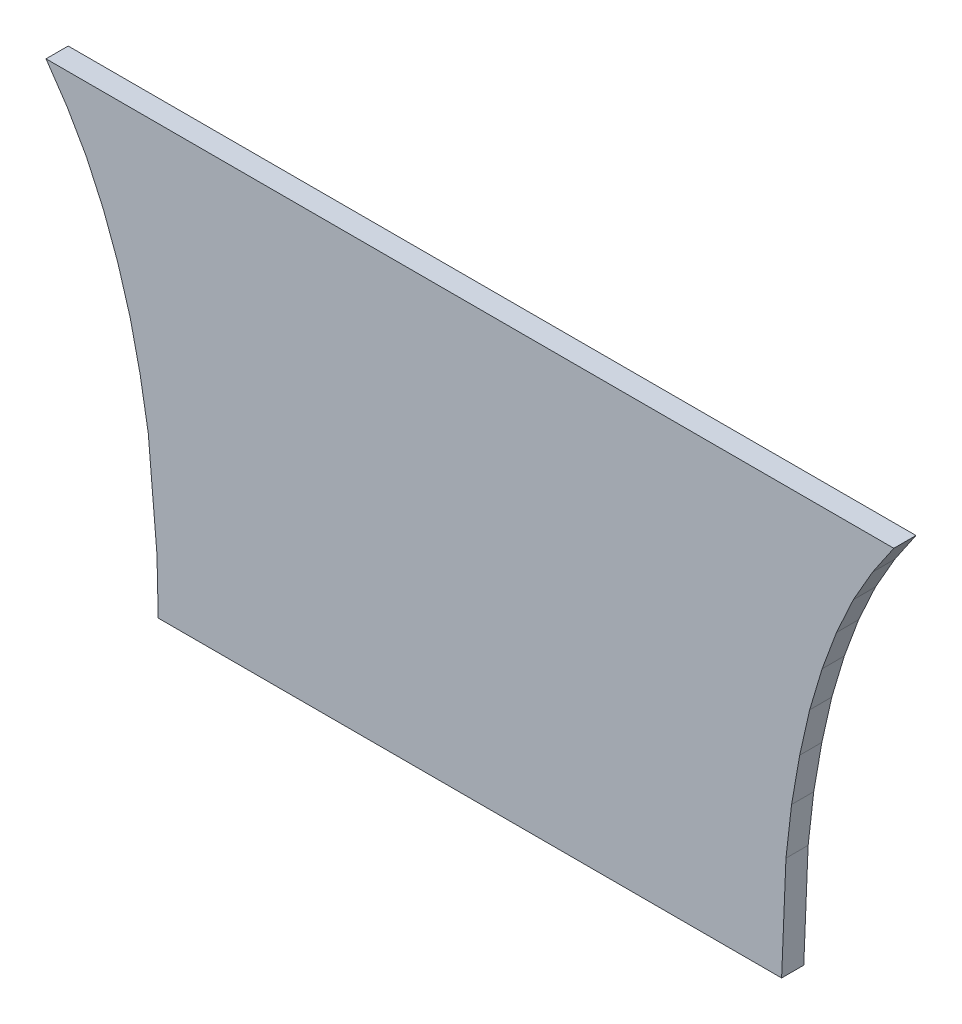
ISO-10303-21;
HEADER;
FILE_DESCRIPTION(('STEP AP214'),'2;1');
FILE_NAME('part.step','',(''),(''),'','','');
FILE_SCHEMA(('AUTOMOTIVE_DESIGN { 1 0 10303 214 1 1 1 1 }'));
ENDSEC;
DATA;
#1=APPLICATION_CONTEXT('core data for automotive mechanical design processes');
#2=APPLICATION_PROTOCOL_DEFINITION('international standard','automotive_design',2000,#1);
#3=PRODUCT_CONTEXT('',#1,'mechanical');
#4=PRODUCT('Part','Part','',(#3));
#5=PRODUCT_RELATED_PRODUCT_CATEGORY('part','',(#4));
#6=PRODUCT_DEFINITION_FORMATION('','',#4);
#7=PRODUCT_DEFINITION_CONTEXT('part definition',#1,'design');
#8=PRODUCT_DEFINITION('design','',#6,#7);
#9=PRODUCT_DEFINITION_SHAPE('','',#8);
#10=(LENGTH_UNIT() NAMED_UNIT(*) SI_UNIT(.MILLI.,.METRE.));
#11=(NAMED_UNIT(*) PLANE_ANGLE_UNIT() SI_UNIT($,.RADIAN.));
#12=(NAMED_UNIT(*) SI_UNIT($,.STERADIAN.) SOLID_ANGLE_UNIT());
#13=UNCERTAINTY_MEASURE_WITH_UNIT(LENGTH_MEASURE(1.E-05),#10,'distance_accuracy_value','');
#14=(GEOMETRIC_REPRESENTATION_CONTEXT(3) GLOBAL_UNCERTAINTY_ASSIGNED_CONTEXT((#13)) GLOBAL_UNIT_ASSIGNED_CONTEXT((#10,
#11,#12)) REPRESENTATION_CONTEXT('',''));
#15=CARTESIAN_POINT('',(0.,0.,0.));
#16=DIRECTION('',(0.,0.,1.));
#17=DIRECTION('',(1.,0.,0.));
#18=AXIS2_PLACEMENT_3D('',#15,#16,#17);
#19=CARTESIAN_POINT('',(46.5,67.2030029296875,0.));
#20=DIRECTION('',(-0.999153314793482,0.0411418708519441,0.));
#21=DIRECTION('',(0.0411418708519441,0.999153314793482,0.));
#22=AXIS2_PLACEMENT_3D('',#19,#20,#21);
#23=PLANE('',#22);
#24=DIRECTION('',(0.0411418708519441,0.999153314793481,0.));
#25=VECTOR('',#24,1.);
#26=CARTESIAN_POINT('',(46.5,67.2030029296875,0.03556));
#27=LINE('',#26,#25);
#28=CARTESIAN_POINT('',(46.5,67.2030029296875,0.03556));
#29=VERTEX_POINT('',#28);
#30=CARTESIAN_POINT('',(46.5069999694824,67.3730010986328,0.03556));
#31=VERTEX_POINT('',#30);
#32=EDGE_CURVE('E11',#29,#31,#27,.T.);
#33=ORIENTED_EDGE('',*,*,#32,.F.);
#34=DIRECTION('',(0.,0.,1.));
#35=VECTOR('',#34,1.);
#36=CARTESIAN_POINT('',(46.5,67.2030029296875,0.));
#37=LINE('',#36,#35);
#38=CARTESIAN_POINT('',(46.5,67.2030029296875,0.));
#39=VERTEX_POINT('',#38);
#40=EDGE_CURVE('E24',#39,#29,#37,.T.);
#41=ORIENTED_EDGE('',*,*,#40,.F.);
#42=DIRECTION('',(0.0411418708519441,0.999153314793481,0.));
#43=VECTOR('',#42,1.);
#44=CARTESIAN_POINT('',(46.5,67.2030029296875,0.));
#45=LINE('',#44,#43);
#46=CARTESIAN_POINT('',(46.5069999694824,67.3730010986328,0.));
#47=VERTEX_POINT('',#46);
#48=EDGE_CURVE('E172',#39,#47,#45,.T.);
#49=ORIENTED_EDGE('',*,*,#48,.T.);
#50=DIRECTION('',(0.,0.,1.));
#51=VECTOR('',#50,1.);
#52=CARTESIAN_POINT('',(46.5069999694824,67.3730010986328,0.));
#53=LINE('',#52,#51);
#54=EDGE_CURVE('E37',#47,#31,#53,.T.);
#55=ORIENTED_EDGE('',*,*,#54,.T.);
#56=EDGE_LOOP('',(#33,#41,#49,#55));
#57=FACE_BOUND('',#56,.T.);
#58=ADVANCED_FACE('F17',(#57),#23,.F.);
#59=CARTESIAN_POINT('',(46.5069999694824,67.3730010986328,0.));
#60=DIRECTION('',(-0.993575127705011,0.113174491852058,0.));
#61=DIRECTION('',(0.113174491852058,0.993575127705011,0.));
#62=AXIS2_PLACEMENT_3D('',#59,#60,#61);
#63=PLANE('',#62);
#64=DIRECTION('',(0.113174491852058,0.993575127705011,0.));
#65=VECTOR('',#64,1.);
#66=CARTESIAN_POINT('',(46.5069999694824,67.3730010986328,0.03556));
#67=LINE('',#66,#65);
#68=CARTESIAN_POINT('',(46.515998840332,67.4520034790039,0.03556));
#69=VERTEX_POINT('',#68);
#70=EDGE_CURVE('E308',#31,#69,#67,.T.);
#71=ORIENTED_EDGE('',*,*,#70,.F.);
#72=ORIENTED_EDGE('',*,*,#54,.F.);
#73=DIRECTION('',(0.113174491852058,0.993575127705011,0.));
#74=VECTOR('',#73,1.);
#75=CARTESIAN_POINT('',(46.5069999694824,67.3730010986328,0.));
#76=LINE('',#75,#74);
#77=CARTESIAN_POINT('',(46.515998840332,67.4520034790039,0.));
#78=VERTEX_POINT('',#77);
#79=EDGE_CURVE('E305',#47,#78,#76,.T.);
#80=ORIENTED_EDGE('',*,*,#79,.T.);
#81=DIRECTION('',(0.,0.,1.));
#82=VECTOR('',#81,1.);
#83=CARTESIAN_POINT('',(46.515998840332,67.4520034790039,0.));
#84=LINE('',#83,#82);
#85=EDGE_CURVE('E303',#78,#69,#84,.T.);
#86=ORIENTED_EDGE('',*,*,#85,.T.);
#87=EDGE_LOOP('',(#71,#72,#80,#86));
#88=FACE_BOUND('',#87,.T.);
#89=ADVANCED_FACE('F316',(#88),#63,.F.);
#90=CARTESIAN_POINT('',(46.515998840332,67.4520034790039,0.));
#91=DIRECTION('',(-0.985305771350904,0.170799698309455,0.));
#92=DIRECTION('',(0.170799698309455,0.985305771350904,0.));
#93=AXIS2_PLACEMENT_3D('',#90,#91,#92);
#94=PLANE('',#93);
#95=DIRECTION('',(0.170799698309455,0.985305771350904,0.));
#96=VECTOR('',#95,1.);
#97=CARTESIAN_POINT('',(46.515998840332,67.4520034790039,0.03556));
#98=LINE('',#97,#96);
#99=CARTESIAN_POINT('',(46.5289993286133,67.5270004272461,0.03556));
#100=VERTEX_POINT('',#99);
#101=EDGE_CURVE('E300',#69,#100,#98,.T.);
#102=ORIENTED_EDGE('',*,*,#101,.F.);
#103=ORIENTED_EDGE('',*,*,#85,.F.);
#104=DIRECTION('',(0.170799698309455,0.985305771350904,0.));
#105=VECTOR('',#104,1.);
#106=CARTESIAN_POINT('',(46.515998840332,67.4520034790039,0.));
#107=LINE('',#106,#105);
#108=CARTESIAN_POINT('',(46.5289993286133,67.5270004272461,0.));
#109=VERTEX_POINT('',#108);
#110=EDGE_CURVE('E297',#78,#109,#107,.T.);
#111=ORIENTED_EDGE('',*,*,#110,.T.);
#112=DIRECTION('',(0.,0.,1.));
#113=VECTOR('',#112,1.);
#114=CARTESIAN_POINT('',(46.5289993286133,67.5270004272461,0.));
#115=LINE('',#114,#113);
#116=EDGE_CURVE('E295',#109,#100,#115,.T.);
#117=ORIENTED_EDGE('',*,*,#116,.T.);
#118=EDGE_LOOP('',(#102,#103,#111,#117));
#119=FACE_BOUND('',#118,.T.);
#120=ADVANCED_FACE('F322',(#119),#94,.F.);
#121=CARTESIAN_POINT('',(46.5289993286133,67.5270004272461,0.));
#122=DIRECTION('',(-0.975538987966482,0.219826483748733,0.));
#123=DIRECTION('',(0.219826483748733,0.975538987966482,0.));
#124=AXIS2_PLACEMENT_3D('',#121,#122,#123);
#125=PLANE('',#124);
#126=DIRECTION('',(0.219826483748733,0.975538987966482,0.));
#127=VECTOR('',#126,1.);
#128=CARTESIAN_POINT('',(46.5289993286133,67.5270004272461,0.03556));
#129=LINE('',#128,#127);
#130=CARTESIAN_POINT('',(46.5449981689453,67.5979995727539,0.03556));
#131=VERTEX_POINT('',#130);
#132=EDGE_CURVE('E292',#100,#131,#129,.T.);
#133=ORIENTED_EDGE('',*,*,#132,.F.);
#134=ORIENTED_EDGE('',*,*,#116,.F.);
#135=DIRECTION('',(0.219826483748733,0.975538987966482,0.));
#136=VECTOR('',#135,1.);
#137=CARTESIAN_POINT('',(46.5289993286133,67.5270004272461,0.));
#138=LINE('',#137,#136);
#139=CARTESIAN_POINT('',(46.5449981689453,67.5979995727539,0.));
#140=VERTEX_POINT('',#139);
#141=EDGE_CURVE('E289',#109,#140,#138,.T.);
#142=ORIENTED_EDGE('',*,*,#141,.T.);
#143=DIRECTION('',(0.,0.,1.));
#144=VECTOR('',#143,1.);
#145=CARTESIAN_POINT('',(46.5449981689453,67.5979995727539,0.));
#146=LINE('',#145,#144);
#147=EDGE_CURVE('E287',#140,#131,#146,.T.);
#148=ORIENTED_EDGE('',*,*,#147,.T.);
#149=EDGE_LOOP('',(#133,#134,#142,#148));
#150=FACE_BOUND('',#149,.T.);
#151=ADVANCED_FACE('F324',(#150),#125,.F.);
#152=CARTESIAN_POINT('',(46.5449981689453,67.5979995727539,0.));
#153=DIRECTION('',(-0.958218790223058,0.28603627403436,0.));
#154=DIRECTION('',(0.28603627403436,0.958218790223058,0.));
#155=AXIS2_PLACEMENT_3D('',#152,#153,#154);
#156=PLANE('',#155);
#157=DIRECTION('',(0.28603627403436,0.958218790223058,0.));
#158=VECTOR('',#157,1.);
#159=CARTESIAN_POINT('',(46.5449981689453,67.5979995727539,0.03556));
#160=LINE('',#159,#158);
#161=CARTESIAN_POINT('',(46.564998626709,67.6650009155273,0.03556));
#162=VERTEX_POINT('',#161);
#163=EDGE_CURVE('E284',#131,#162,#160,.T.);
#164=ORIENTED_EDGE('',*,*,#163,.F.);
#165=ORIENTED_EDGE('',*,*,#147,.F.);
#166=DIRECTION('',(0.28603627403436,0.958218790223058,0.));
#167=VECTOR('',#166,1.);
#168=CARTESIAN_POINT('',(46.5449981689453,67.5979995727539,0.));
#169=LINE('',#168,#167);
#170=CARTESIAN_POINT('',(46.564998626709,67.6650009155273,0.));
#171=VERTEX_POINT('',#170);
#172=EDGE_CURVE('E281',#140,#171,#169,.T.);
#173=ORIENTED_EDGE('',*,*,#172,.T.);
#174=DIRECTION('',(0.,0.,1.));
#175=VECTOR('',#174,1.);
#176=CARTESIAN_POINT('',(46.564998626709,67.6650009155273,0.));
#177=LINE('',#176,#175);
#178=EDGE_CURVE('E279',#171,#162,#177,.T.);
#179=ORIENTED_EDGE('',*,*,#178,.T.);
#180=EDGE_LOOP('',(#164,#165,#173,#179));
#181=FACE_BOUND('',#180,.T.);
#182=ADVANCED_FACE('F329',(#181),#156,.F.);
#183=CARTESIAN_POINT('',(46.564998626709,67.6650009155273,0.));
#184=DIRECTION('',(-0.93754679850257,0.347859167792918,0.));
#185=DIRECTION('',(0.347859167792918,0.93754679850257,0.));
#186=AXIS2_PLACEMENT_3D('',#183,#184,#185);
#187=PLANE('',#186);
#188=DIRECTION('',(0.347859167792918,0.93754679850257,0.));
#189=VECTOR('',#188,1.);
#190=CARTESIAN_POINT('',(46.564998626709,67.6650009155273,0.03556));
#191=LINE('',#190,#189);
#192=CARTESIAN_POINT('',(46.5880012512207,67.7269973754883,0.03556));
#193=VERTEX_POINT('',#192);
#194=EDGE_CURVE('E276',#162,#193,#191,.T.);
#195=ORIENTED_EDGE('',*,*,#194,.F.);
#196=ORIENTED_EDGE('',*,*,#178,.F.);
#197=DIRECTION('',(0.347859167792918,0.93754679850257,0.));
#198=VECTOR('',#197,1.);
#199=CARTESIAN_POINT('',(46.564998626709,67.6650009155273,0.));
#200=LINE('',#199,#198);
#201=CARTESIAN_POINT('',(46.5880012512207,67.7269973754883,0.));
#202=VERTEX_POINT('',#201);
#203=EDGE_CURVE('E273',#171,#202,#200,.T.);
#204=ORIENTED_EDGE('',*,*,#203,.T.);
#205=DIRECTION('',(0.,0.,1.));
#206=VECTOR('',#205,1.);
#207=CARTESIAN_POINT('',(46.5880012512207,67.7269973754883,0.));
#208=LINE('',#207,#206);
#209=EDGE_CURVE('E271',#202,#193,#208,.T.);
#210=ORIENTED_EDGE('',*,*,#209,.T.);
#211=EDGE_LOOP('',(#195,#196,#204,#210));
#212=FACE_BOUND('',#211,.T.);
#213=ADVANCED_FACE('F332',(#212),#187,.F.);
#214=CARTESIAN_POINT('',(46.5880012512207,67.7269973754883,0.));
#215=DIRECTION('',(-0.909320717212221,0.416095942360234,0.));
#216=DIRECTION('',(0.416095942360234,0.909320717212221,0.));
#217=AXIS2_PLACEMENT_3D('',#214,#215,#216);
#218=PLANE('',#217);
#219=DIRECTION('',(0.416095942360234,0.909320717212221,0.));
#220=VECTOR('',#219,1.);
#221=CARTESIAN_POINT('',(46.5880012512207,67.7269973754883,0.03556));
#222=LINE('',#221,#220);
#223=CARTESIAN_POINT('',(46.6150016784668,67.786003112793,0.03556));
#224=VERTEX_POINT('',#223);
#225=EDGE_CURVE('E268',#193,#224,#222,.T.);
#226=ORIENTED_EDGE('',*,*,#225,.F.);
#227=ORIENTED_EDGE('',*,*,#209,.F.);
#228=DIRECTION('',(0.416095942360234,0.909320717212221,0.));
#229=VECTOR('',#228,1.);
#230=CARTESIAN_POINT('',(46.5880012512207,67.7269973754883,0.));
#231=LINE('',#230,#229);
#232=CARTESIAN_POINT('',(46.6150016784668,67.786003112793,0.));
#233=VERTEX_POINT('',#232);
#234=EDGE_CURVE('E265',#202,#233,#231,.T.);
#235=ORIENTED_EDGE('',*,*,#234,.T.);
#236=DIRECTION('',(0.,0.,1.));
#237=VECTOR('',#236,1.);
#238=CARTESIAN_POINT('',(46.6150016784668,67.786003112793,0.));
#239=LINE('',#238,#237);
#240=EDGE_CURVE('E263',#233,#224,#239,.T.);
#241=ORIENTED_EDGE('',*,*,#240,.T.);
#242=EDGE_LOOP('',(#226,#227,#235,#241));
#243=FACE_BOUND('',#242,.T.);
#244=ADVANCED_FACE('F337',(#243),#218,.F.);
#245=CARTESIAN_POINT('',(46.6150016784668,67.786003112793,0.));
#246=DIRECTION('',(-0.867238398855838,0.497893120609195,0.));
#247=DIRECTION('',(0.497893120609195,0.867238398855838,0.));
#248=AXIS2_PLACEMENT_3D('',#245,#246,#247);
#249=PLANE('',#248);
#250=DIRECTION('',(0.497893120609195,0.867238398855838,0.));
#251=VECTOR('',#250,1.);
#252=CARTESIAN_POINT('',(46.6150016784668,67.786003112793,0.03556));
#253=LINE('',#252,#251);
#254=CARTESIAN_POINT('',(46.6459999084473,67.8399963378906,0.03556));
#255=VERTEX_POINT('',#254);
#256=EDGE_CURVE('E260',#224,#255,#253,.T.);
#257=ORIENTED_EDGE('',*,*,#256,.F.);
#258=ORIENTED_EDGE('',*,*,#240,.F.);
#259=DIRECTION('',(0.497893120609195,0.867238398855838,0.));
#260=VECTOR('',#259,1.);
#261=CARTESIAN_POINT('',(46.6150016784668,67.786003112793,0.));
#262=LINE('',#261,#260);
#263=CARTESIAN_POINT('',(46.6459999084473,67.8399963378906,0.));
#264=VERTEX_POINT('',#263);
#265=EDGE_CURVE('E257',#233,#264,#262,.T.);
#266=ORIENTED_EDGE('',*,*,#265,.T.);
#267=DIRECTION('',(0.,0.,1.));
#268=VECTOR('',#267,1.);
#269=CARTESIAN_POINT('',(46.6459999084473,67.8399963378906,0.));
#270=LINE('',#269,#268);
#271=EDGE_CURVE('E255',#264,#255,#270,.T.);
#272=ORIENTED_EDGE('',*,*,#271,.T.);
#273=EDGE_LOOP('',(#257,#258,#266,#272));
#274=FACE_BOUND('',#273,.T.);
#275=ADVANCED_FACE('F340',(#274),#249,.F.);
#276=CARTESIAN_POINT('',(46.6459999084473,67.8399963378906,0.));
#277=DIRECTION('',(-0.826939409070342,0.562291040055231,0.));
#278=DIRECTION('',(0.562291040055231,0.826939409070342,0.));
#279=AXIS2_PLACEMENT_3D('',#276,#277,#278);
#280=PLANE('',#279);
#281=DIRECTION('',(0.562291040055231,0.826939409070342,0.));
#282=VECTOR('',#281,1.);
#283=CARTESIAN_POINT('',(46.6459999084473,67.8399963378906,0.03556));
#284=LINE('',#283,#282);
#285=CARTESIAN_POINT('',(46.6800003051758,67.8899993896484,0.03556));
#286=VERTEX_POINT('',#285);
#287=EDGE_CURVE('E252',#255,#286,#284,.T.);
#288=ORIENTED_EDGE('',*,*,#287,.F.);
#289=ORIENTED_EDGE('',*,*,#271,.F.);
#290=DIRECTION('',(0.562291040055231,0.826939409070342,0.));
#291=VECTOR('',#290,1.);
#292=CARTESIAN_POINT('',(46.6459999084473,67.8399963378906,0.));
#293=LINE('',#292,#291);
#294=CARTESIAN_POINT('',(46.6800003051758,67.8899993896484,0.));
#295=VERTEX_POINT('',#294);
#296=EDGE_CURVE('E249',#264,#295,#293,.T.);
#297=ORIENTED_EDGE('',*,*,#296,.T.);
#298=DIRECTION('',(0.,0.,1.));
#299=VECTOR('',#298,1.);
#300=CARTESIAN_POINT('',(46.6800003051758,67.8899993896484,0.));
#301=LINE('',#300,#299);
#302=EDGE_CURVE('E247',#295,#286,#301,.T.);
#303=ORIENTED_EDGE('',*,*,#302,.T.);
#304=EDGE_LOOP('',(#288,#289,#297,#303));
#305=FACE_BOUND('',#304,.T.);
#306=ADVANCED_FACE('F345',(#305),#280,.F.);
#307=CARTESIAN_POINT('',(46.6800003051758,67.8899993896485,0.));
#308=DIRECTION('',(0.,-1.,0.));
#309=DIRECTION('',(-1.,0.,0.));
#310=AXIS2_PLACEMENT_3D('',#307,#308,#309);
#311=PLANE('',#310);
#312=DIRECTION('',(-1.,0.,0.));
#313=VECTOR('',#312,1.);
#314=CARTESIAN_POINT('',(46.6800003051758,67.8899993896484,0.03556));
#315=LINE('',#314,#313);
#316=CARTESIAN_POINT('',(45.3199996948242,67.8899993896484,0.03556));
#317=VERTEX_POINT('',#316);
#318=EDGE_CURVE('E244',#286,#317,#315,.T.);
#319=ORIENTED_EDGE('',*,*,#318,.F.);
#320=ORIENTED_EDGE('',*,*,#302,.F.);
#321=DIRECTION('',(-1.,0.,0.));
#322=VECTOR('',#321,1.);
#323=CARTESIAN_POINT('',(46.6800003051758,67.8899993896484,0.));
#324=LINE('',#323,#322);
#325=CARTESIAN_POINT('',(45.3199996948242,67.8899993896484,0.));
#326=VERTEX_POINT('',#325);
#327=EDGE_CURVE('E241',#295,#326,#324,.T.);
#328=ORIENTED_EDGE('',*,*,#327,.T.);
#329=DIRECTION('',(0.,0.,1.));
#330=VECTOR('',#329,1.);
#331=CARTESIAN_POINT('',(45.3199996948242,67.8899993896484,0.));
#332=LINE('',#331,#330);
#333=EDGE_CURVE('E239',#326,#317,#332,.T.);
#334=ORIENTED_EDGE('',*,*,#333,.T.);
#335=EDGE_LOOP('',(#319,#320,#328,#334));
#336=FACE_BOUND('',#335,.T.);
#337=ADVANCED_FACE('F348',(#336),#311,.F.);
#338=CARTESIAN_POINT('',(45.3199996948242,67.8899993896485,0.));
#339=DIRECTION('',(0.826939409070342,0.562291040055231,0.));
#340=DIRECTION('',(0.562291040055231,-0.826939409070342,0.));
#341=AXIS2_PLACEMENT_3D('',#338,#339,#340);
#342=PLANE('',#341);
#343=DIRECTION('',(0.562291040055231,-0.826939409070342,0.));
#344=VECTOR('',#343,1.);
#345=CARTESIAN_POINT('',(45.3199996948242,67.8899993896484,0.03556));
#346=LINE('',#345,#344);
#347=CARTESIAN_POINT('',(45.3540000915527,67.8399963378906,0.03556));
#348=VERTEX_POINT('',#347);
#349=EDGE_CURVE('E236',#317,#348,#346,.T.);
#350=ORIENTED_EDGE('',*,*,#349,.F.);
#351=ORIENTED_EDGE('',*,*,#333,.F.);
#352=DIRECTION('',(0.562291040055231,-0.826939409070342,0.));
#353=VECTOR('',#352,1.);
#354=CARTESIAN_POINT('',(45.3199996948242,67.8899993896484,0.));
#355=LINE('',#354,#353);
#356=CARTESIAN_POINT('',(45.3540000915527,67.8399963378906,0.));
#357=VERTEX_POINT('',#356);
#358=EDGE_CURVE('E233',#326,#357,#355,.T.);
#359=ORIENTED_EDGE('',*,*,#358,.T.);
#360=DIRECTION('',(0.,0.,1.));
#361=VECTOR('',#360,1.);
#362=CARTESIAN_POINT('',(45.3540000915527,67.8399963378906,0.));
#363=LINE('',#362,#361);
#364=EDGE_CURVE('E231',#357,#348,#363,.T.);
#365=ORIENTED_EDGE('',*,*,#364,.T.);
#366=EDGE_LOOP('',(#350,#351,#359,#365));
#367=FACE_BOUND('',#366,.T.);
#368=ADVANCED_FACE('F353',(#367),#342,.F.);
#369=CARTESIAN_POINT('',(45.3540000915527,67.8399963378906,0.));
#370=DIRECTION('',(0.867238398855838,0.497893120609195,0.));
#371=DIRECTION('',(0.497893120609195,-0.867238398855838,0.));
#372=AXIS2_PLACEMENT_3D('',#369,#370,#371);
#373=PLANE('',#372);
#374=DIRECTION('',(0.497893120609195,-0.867238398855838,0.));
#375=VECTOR('',#374,1.);
#376=CARTESIAN_POINT('',(45.3540000915527,67.8399963378906,0.03556));
#377=LINE('',#376,#375);
#378=CARTESIAN_POINT('',(45.3849983215332,67.786003112793,0.03556));
#379=VERTEX_POINT('',#378);
#380=EDGE_CURVE('E228',#348,#379,#377,.T.);
#381=ORIENTED_EDGE('',*,*,#380,.F.);
#382=ORIENTED_EDGE('',*,*,#364,.F.);
#383=DIRECTION('',(0.497893120609195,-0.867238398855838,0.));
#384=VECTOR('',#383,1.);
#385=CARTESIAN_POINT('',(45.3540000915527,67.8399963378906,0.));
#386=LINE('',#385,#384);
#387=CARTESIAN_POINT('',(45.3849983215332,67.786003112793,0.));
#388=VERTEX_POINT('',#387);
#389=EDGE_CURVE('E225',#357,#388,#386,.T.);
#390=ORIENTED_EDGE('',*,*,#389,.T.);
#391=DIRECTION('',(0.,0.,1.));
#392=VECTOR('',#391,1.);
#393=CARTESIAN_POINT('',(45.3849983215332,67.786003112793,0.));
#394=LINE('',#393,#392);
#395=EDGE_CURVE('E223',#388,#379,#394,.T.);
#396=ORIENTED_EDGE('',*,*,#395,.T.);
#397=EDGE_LOOP('',(#381,#382,#390,#396));
#398=FACE_BOUND('',#397,.T.);
#399=ADVANCED_FACE('F356',(#398),#373,.F.);
#400=CARTESIAN_POINT('',(45.3849983215332,67.786003112793,0.));
#401=DIRECTION('',(0.909320717212221,0.416095942360234,0.));
#402=DIRECTION('',(0.416095942360234,-0.909320717212221,0.));
#403=AXIS2_PLACEMENT_3D('',#400,#401,#402);
#404=PLANE('',#403);
#405=DIRECTION('',(0.416095942360234,-0.909320717212221,0.));
#406=VECTOR('',#405,1.);
#407=CARTESIAN_POINT('',(45.3849983215332,67.786003112793,0.03556));
#408=LINE('',#407,#406);
#409=CARTESIAN_POINT('',(45.4119987487793,67.7269973754883,0.03556));
#410=VERTEX_POINT('',#409);
#411=EDGE_CURVE('E220',#379,#410,#408,.T.);
#412=ORIENTED_EDGE('',*,*,#411,.F.);
#413=ORIENTED_EDGE('',*,*,#395,.F.);
#414=DIRECTION('',(0.416095942360234,-0.909320717212221,0.));
#415=VECTOR('',#414,1.);
#416=CARTESIAN_POINT('',(45.3849983215332,67.786003112793,0.));
#417=LINE('',#416,#415);
#418=CARTESIAN_POINT('',(45.4119987487793,67.7269973754883,0.));
#419=VERTEX_POINT('',#418);
#420=EDGE_CURVE('E217',#388,#419,#417,.T.);
#421=ORIENTED_EDGE('',*,*,#420,.T.);
#422=DIRECTION('',(0.,0.,1.));
#423=VECTOR('',#422,1.);
#424=CARTESIAN_POINT('',(45.4119987487793,67.7269973754883,0.));
#425=LINE('',#424,#423);
#426=EDGE_CURVE('E215',#419,#410,#425,.T.);
#427=ORIENTED_EDGE('',*,*,#426,.T.);
#428=EDGE_LOOP('',(#412,#413,#421,#427));
#429=FACE_BOUND('',#428,.T.);
#430=ADVANCED_FACE('F361',(#429),#404,.F.);
#431=CARTESIAN_POINT('',(45.4119987487793,67.7269973754883,0.));
#432=DIRECTION('',(0.93754679850257,0.347859167792918,0.));
#433=DIRECTION('',(0.347859167792918,-0.93754679850257,0.));
#434=AXIS2_PLACEMENT_3D('',#431,#432,#433);
#435=PLANE('',#434);
#436=DIRECTION('',(0.347859167792918,-0.93754679850257,0.));
#437=VECTOR('',#436,1.);
#438=CARTESIAN_POINT('',(45.4119987487793,67.7269973754883,0.03556));
#439=LINE('',#438,#437);
#440=CARTESIAN_POINT('',(45.435001373291,67.6650009155273,0.03556));
#441=VERTEX_POINT('',#440);
#442=EDGE_CURVE('E212',#410,#441,#439,.T.);
#443=ORIENTED_EDGE('',*,*,#442,.F.);
#444=ORIENTED_EDGE('',*,*,#426,.F.);
#445=DIRECTION('',(0.347859167792918,-0.93754679850257,0.));
#446=VECTOR('',#445,1.);
#447=CARTESIAN_POINT('',(45.4119987487793,67.7269973754883,0.));
#448=LINE('',#447,#446);
#449=CARTESIAN_POINT('',(45.435001373291,67.6650009155273,0.));
#450=VERTEX_POINT('',#449);
#451=EDGE_CURVE('E209',#419,#450,#448,.T.);
#452=ORIENTED_EDGE('',*,*,#451,.T.);
#453=DIRECTION('',(0.,0.,1.));
#454=VECTOR('',#453,1.);
#455=CARTESIAN_POINT('',(45.435001373291,67.6650009155273,0.));
#456=LINE('',#455,#454);
#457=EDGE_CURVE('E207',#450,#441,#456,.T.);
#458=ORIENTED_EDGE('',*,*,#457,.T.);
#459=EDGE_LOOP('',(#443,#444,#452,#458));
#460=FACE_BOUND('',#459,.T.);
#461=ADVANCED_FACE('F364',(#460),#435,.F.);
#462=CARTESIAN_POINT('',(45.435001373291,67.6650009155273,0.));
#463=DIRECTION('',(0.958218790223058,0.28603627403436,0.));
#464=DIRECTION('',(0.28603627403436,-0.958218790223058,0.));
#465=AXIS2_PLACEMENT_3D('',#462,#463,#464);
#466=PLANE('',#465);
#467=DIRECTION('',(0.28603627403436,-0.958218790223058,0.));
#468=VECTOR('',#467,1.);
#469=CARTESIAN_POINT('',(45.435001373291,67.6650009155273,0.03556));
#470=LINE('',#469,#468);
#471=CARTESIAN_POINT('',(45.4550018310547,67.5979995727539,0.03556));
#472=VERTEX_POINT('',#471);
#473=EDGE_CURVE('E204',#441,#472,#470,.T.);
#474=ORIENTED_EDGE('',*,*,#473,.F.);
#475=ORIENTED_EDGE('',*,*,#457,.F.);
#476=DIRECTION('',(0.28603627403436,-0.958218790223058,0.));
#477=VECTOR('',#476,1.);
#478=CARTESIAN_POINT('',(45.435001373291,67.6650009155273,0.));
#479=LINE('',#478,#477);
#480=CARTESIAN_POINT('',(45.4550018310547,67.5979995727539,0.));
#481=VERTEX_POINT('',#480);
#482=EDGE_CURVE('E201',#450,#481,#479,.T.);
#483=ORIENTED_EDGE('',*,*,#482,.T.);
#484=DIRECTION('',(0.,0.,1.));
#485=VECTOR('',#484,1.);
#486=CARTESIAN_POINT('',(45.4550018310547,67.5979995727539,0.));
#487=LINE('',#486,#485);
#488=EDGE_CURVE('E199',#481,#472,#487,.T.);
#489=ORIENTED_EDGE('',*,*,#488,.T.);
#490=EDGE_LOOP('',(#474,#475,#483,#489));
#491=FACE_BOUND('',#490,.T.);
#492=ADVANCED_FACE('F369',(#491),#466,.F.);
#493=CARTESIAN_POINT('',(45.4550018310547,67.5979995727539,0.));
#494=DIRECTION('',(0.975538987966482,0.219826483748733,0.));
#495=DIRECTION('',(0.219826483748733,-0.975538987966482,0.));
#496=AXIS2_PLACEMENT_3D('',#493,#494,#495);
#497=PLANE('',#496);
#498=DIRECTION('',(0.219826483748733,-0.975538987966482,0.));
#499=VECTOR('',#498,1.);
#500=CARTESIAN_POINT('',(45.4550018310547,67.5979995727539,0.03556));
#501=LINE('',#500,#499);
#502=CARTESIAN_POINT('',(45.4710006713867,67.5270004272461,0.03556));
#503=VERTEX_POINT('',#502);
#504=EDGE_CURVE('E196',#472,#503,#501,.T.);
#505=ORIENTED_EDGE('',*,*,#504,.F.);
#506=ORIENTED_EDGE('',*,*,#488,.F.);
#507=DIRECTION('',(0.219826483748733,-0.975538987966482,0.));
#508=VECTOR('',#507,1.);
#509=CARTESIAN_POINT('',(45.4550018310547,67.5979995727539,0.));
#510=LINE('',#509,#508);
#511=CARTESIAN_POINT('',(45.4710006713867,67.5270004272461,0.));
#512=VERTEX_POINT('',#511);
#513=EDGE_CURVE('E193',#481,#512,#510,.T.);
#514=ORIENTED_EDGE('',*,*,#513,.T.);
#515=DIRECTION('',(0.,0.,1.));
#516=VECTOR('',#515,1.);
#517=CARTESIAN_POINT('',(45.4710006713867,67.5270004272461,0.));
#518=LINE('',#517,#516);
#519=EDGE_CURVE('E191',#512,#503,#518,.T.);
#520=ORIENTED_EDGE('',*,*,#519,.T.);
#521=EDGE_LOOP('',(#505,#506,#514,#520));
#522=FACE_BOUND('',#521,.T.);
#523=ADVANCED_FACE('F372',(#522),#497,.F.);
#524=CARTESIAN_POINT('',(45.4710006713867,67.5270004272461,0.));
#525=DIRECTION('',(0.985305771350904,0.170799698309455,0.));
#526=DIRECTION('',(0.170799698309455,-0.985305771350904,0.));
#527=AXIS2_PLACEMENT_3D('',#524,#525,#526);
#528=PLANE('',#527);
#529=DIRECTION('',(0.170799698309455,-0.985305771350904,0.));
#530=VECTOR('',#529,1.);
#531=CARTESIAN_POINT('',(45.4710006713867,67.5270004272461,0.03556));
#532=LINE('',#531,#530);
#533=CARTESIAN_POINT('',(45.484001159668,67.4520034790039,0.03556));
#534=VERTEX_POINT('',#533);
#535=EDGE_CURVE('E188',#503,#534,#532,.T.);
#536=ORIENTED_EDGE('',*,*,#535,.F.);
#537=ORIENTED_EDGE('',*,*,#519,.F.);
#538=DIRECTION('',(0.170799698309455,-0.985305771350904,0.));
#539=VECTOR('',#538,1.);
#540=CARTESIAN_POINT('',(45.4710006713867,67.5270004272461,0.));
#541=LINE('',#540,#539);
#542=CARTESIAN_POINT('',(45.484001159668,67.4520034790039,0.));
#543=VERTEX_POINT('',#542);
#544=EDGE_CURVE('E185',#512,#543,#541,.T.);
#545=ORIENTED_EDGE('',*,*,#544,.T.);
#546=DIRECTION('',(0.,0.,1.));
#547=VECTOR('',#546,1.);
#548=CARTESIAN_POINT('',(45.484001159668,67.4520034790039,0.));
#549=LINE('',#548,#547);
#550=EDGE_CURVE('E183',#543,#534,#549,.T.);
#551=ORIENTED_EDGE('',*,*,#550,.T.);
#552=EDGE_LOOP('',(#536,#537,#545,#551));
#553=FACE_BOUND('',#552,.T.);
#554=ADVANCED_FACE('F377',(#553),#528,.F.);
#555=CARTESIAN_POINT('',(45.484001159668,67.4520034790039,0.));
#556=DIRECTION('',(0.996286749097029,0.0860971171043161,0.));
#557=DIRECTION('',(0.0860971171043161,-0.996286749097029,0.));
#558=AXIS2_PLACEMENT_3D('',#555,#556,#557);
#559=PLANE('',#558);
#560=DIRECTION('',(0.0860971171043161,-0.996286749097029,0.));
#561=VECTOR('',#560,1.);
#562=CARTESIAN_POINT('',(45.484001159668,67.4520034790039,0.03556));
#563=LINE('',#562,#561);
#564=CARTESIAN_POINT('',(45.4980010986328,67.2900009155273,0.03556));
#565=VERTEX_POINT('',#564);
#566=EDGE_CURVE('E180',#534,#565,#563,.T.);
#567=ORIENTED_EDGE('',*,*,#566,.F.);
#568=ORIENTED_EDGE('',*,*,#550,.F.);
#569=DIRECTION('',(0.0860971171043161,-0.996286749097029,0.));
#570=VECTOR('',#569,1.);
#571=CARTESIAN_POINT('',(45.484001159668,67.4520034790039,0.));
#572=LINE('',#571,#570);
#573=CARTESIAN_POINT('',(45.4980010986328,67.2900009155273,0.));
#574=VERTEX_POINT('',#573);
#575=EDGE_CURVE('E178',#543,#574,#572,.T.);
#576=ORIENTED_EDGE('',*,*,#575,.T.);
#577=DIRECTION('',(0.,0.,1.));
#578=VECTOR('',#577,1.);
#579=CARTESIAN_POINT('',(45.4980010986328,67.2900009155273,0.));
#580=LINE('',#579,#578);
#581=EDGE_CURVE('E163',#574,#565,#580,.T.);
#582=ORIENTED_EDGE('',*,*,#581,.T.);
#583=EDGE_LOOP('',(#567,#568,#576,#582));
#584=FACE_BOUND('',#583,.T.);
#585=ADVANCED_FACE('F379',(#584),#559,.F.);
#586=CARTESIAN_POINT('',(45.4980010986328,67.2900009155273,0.));
#587=DIRECTION('',(0.999736146762811,0.0229703473166585,0.));
#588=DIRECTION('',(0.0229703473166585,-0.999736146762811,0.));
#589=AXIS2_PLACEMENT_3D('',#586,#587,#588);
#590=PLANE('',#589);
#591=DIRECTION('',(0.0229703473166585,-0.999736146762811,0.));
#592=VECTOR('',#591,1.);
#593=CARTESIAN_POINT('',(45.4980010986328,67.2900009155273,0.03556));
#594=LINE('',#593,#592);
#595=CARTESIAN_POINT('',(45.5,67.2030029296875,0.03556));
#596=VERTEX_POINT('',#595);
#597=EDGE_CURVE('E167',#565,#596,#594,.T.);
#598=ORIENTED_EDGE('',*,*,#597,.F.);
#599=ORIENTED_EDGE('',*,*,#581,.F.);
#600=DIRECTION('',(0.0229703473166585,-0.999736146762811,0.));
#601=VECTOR('',#600,1.);
#602=CARTESIAN_POINT('',(45.4980010986328,67.2900009155273,0.));
#603=LINE('',#602,#601);
#604=CARTESIAN_POINT('',(45.5,67.2030029296875,0.));
#605=VERTEX_POINT('',#604);
#606=EDGE_CURVE('E159',#574,#605,#603,.T.);
#607=ORIENTED_EDGE('',*,*,#606,.T.);
#608=DIRECTION('',(0.,0.,1.));
#609=VECTOR('',#608,1.);
#610=CARTESIAN_POINT('',(45.5,67.2030029296875,0.));
#611=LINE('',#610,#609);
#612=EDGE_CURVE('E149',#605,#596,#611,.T.);
#613=ORIENTED_EDGE('',*,*,#612,.T.);
#614=EDGE_LOOP('',(#598,#599,#607,#613));
#615=FACE_BOUND('',#614,.T.);
#616=ADVANCED_FACE('F162',(#615),#590,.F.);
#617=CARTESIAN_POINT('',(45.5,67.2030029296875,0.));
#618=DIRECTION('',(0.,1.,0.));
#619=DIRECTION('',(1.,0.,0.));
#620=AXIS2_PLACEMENT_3D('',#617,#618,#619);
#621=PLANE('',#620);
#622=DIRECTION('',(1.,0.,0.));
#623=VECTOR('',#622,1.);
#624=CARTESIAN_POINT('',(45.5,67.2030029296875,0.03556));
#625=LINE('',#624,#623);
#626=EDGE_CURVE('E155',#596,#29,#625,.T.);
#627=ORIENTED_EDGE('',*,*,#626,.F.);
#628=ORIENTED_EDGE('',*,*,#612,.F.);
#629=DIRECTION('',(1.,0.,0.));
#630=VECTOR('',#629,1.);
#631=CARTESIAN_POINT('',(45.5,67.2030029296875,0.));
#632=LINE('',#631,#630);
#633=EDGE_CURVE('E153',#605,#39,#632,.T.);
#634=ORIENTED_EDGE('',*,*,#633,.T.);
#635=ORIENTED_EDGE('',*,*,#40,.T.);
#636=EDGE_LOOP('',(#627,#628,#634,#635));
#637=FACE_BOUND('',#636,.T.);
#638=ADVANCED_FACE('F151',(#637),#621,.F.);
#639=CARTESIAN_POINT('',(46.5,67.2030029296875,0.));
#640=DIRECTION('',(0.,0.,1.));
#641=DIRECTION('',(1.,0.,0.));
#642=AXIS2_PLACEMENT_3D('',#639,#640,#641);
#643=PLANE('',#642);
#644=ORIENTED_EDGE('',*,*,#633,.F.);
#645=ORIENTED_EDGE('',*,*,#606,.F.);
#646=ORIENTED_EDGE('',*,*,#575,.F.);
#647=ORIENTED_EDGE('',*,*,#544,.F.);
#648=ORIENTED_EDGE('',*,*,#513,.F.);
#649=ORIENTED_EDGE('',*,*,#482,.F.);
#650=ORIENTED_EDGE('',*,*,#451,.F.);
#651=ORIENTED_EDGE('',*,*,#420,.F.);
#652=ORIENTED_EDGE('',*,*,#389,.F.);
#653=ORIENTED_EDGE('',*,*,#358,.F.);
#654=ORIENTED_EDGE('',*,*,#327,.F.);
#655=ORIENTED_EDGE('',*,*,#296,.F.);
#656=ORIENTED_EDGE('',*,*,#265,.F.);
#657=ORIENTED_EDGE('',*,*,#234,.F.);
#658=ORIENTED_EDGE('',*,*,#203,.F.);
#659=ORIENTED_EDGE('',*,*,#172,.F.);
#660=ORIENTED_EDGE('',*,*,#141,.F.);
#661=ORIENTED_EDGE('',*,*,#110,.F.);
#662=ORIENTED_EDGE('',*,*,#79,.F.);
#663=ORIENTED_EDGE('',*,*,#48,.F.);
#664=EDGE_LOOP('',(#644,#645,#646,#647,#648,#649,#650,#651,#652,#653,#654,#655,#656,#657,#658,
#659,#660,#661,#662,#663));
#665=FACE_BOUND('',#664,.T.);
#666=ADVANCED_FACE('F170',(#665),#643,.F.);
#667=CARTESIAN_POINT('',(46.5,67.2030029296875,0.03556));
#668=DIRECTION('',(0.,0.,1.));
#669=DIRECTION('',(1.,0.,0.));
#670=AXIS2_PLACEMENT_3D('',#667,#668,#669);
#671=PLANE('',#670);
#672=ORIENTED_EDGE('',*,*,#32,.T.);
#673=ORIENTED_EDGE('',*,*,#70,.T.);
#674=ORIENTED_EDGE('',*,*,#101,.T.);
#675=ORIENTED_EDGE('',*,*,#132,.T.);
#676=ORIENTED_EDGE('',*,*,#163,.T.);
#677=ORIENTED_EDGE('',*,*,#194,.T.);
#678=ORIENTED_EDGE('',*,*,#225,.T.);
#679=ORIENTED_EDGE('',*,*,#256,.T.);
#680=ORIENTED_EDGE('',*,*,#287,.T.);
#681=ORIENTED_EDGE('',*,*,#318,.T.);
#682=ORIENTED_EDGE('',*,*,#349,.T.);
#683=ORIENTED_EDGE('',*,*,#380,.T.);
#684=ORIENTED_EDGE('',*,*,#411,.T.);
#685=ORIENTED_EDGE('',*,*,#442,.T.);
#686=ORIENTED_EDGE('',*,*,#473,.T.);
#687=ORIENTED_EDGE('',*,*,#504,.T.);
#688=ORIENTED_EDGE('',*,*,#535,.T.);
#689=ORIENTED_EDGE('',*,*,#566,.T.);
#690=ORIENTED_EDGE('',*,*,#597,.T.);
#691=ORIENTED_EDGE('',*,*,#626,.T.);
#692=EDGE_LOOP('',(#672,#673,#674,#675,#676,#677,#678,#679,#680,#681,#682,#683,#684,#685,#686,
#687,#688,#689,#690,#691));
#693=FACE_BOUND('',#692,.T.);
#694=ADVANCED_FACE('F319',(#693),#671,.T.);
#695=CLOSED_SHELL('',(#58,#89,#120,#151,#182,#213,#244,#275,#306,#337,#368,#399,#430,#461,#492,
#523,#554,#585,#616,#638,#666,#694));
#696=MANIFOLD_SOLID_BREP('B1',#695);
#697=ADVANCED_BREP_SHAPE_REPRESENTATION('',(#18,#696),#14);
#698=SHAPE_DEFINITION_REPRESENTATION(#9,#697);
ENDSEC;
END-ISO-10303-21;
